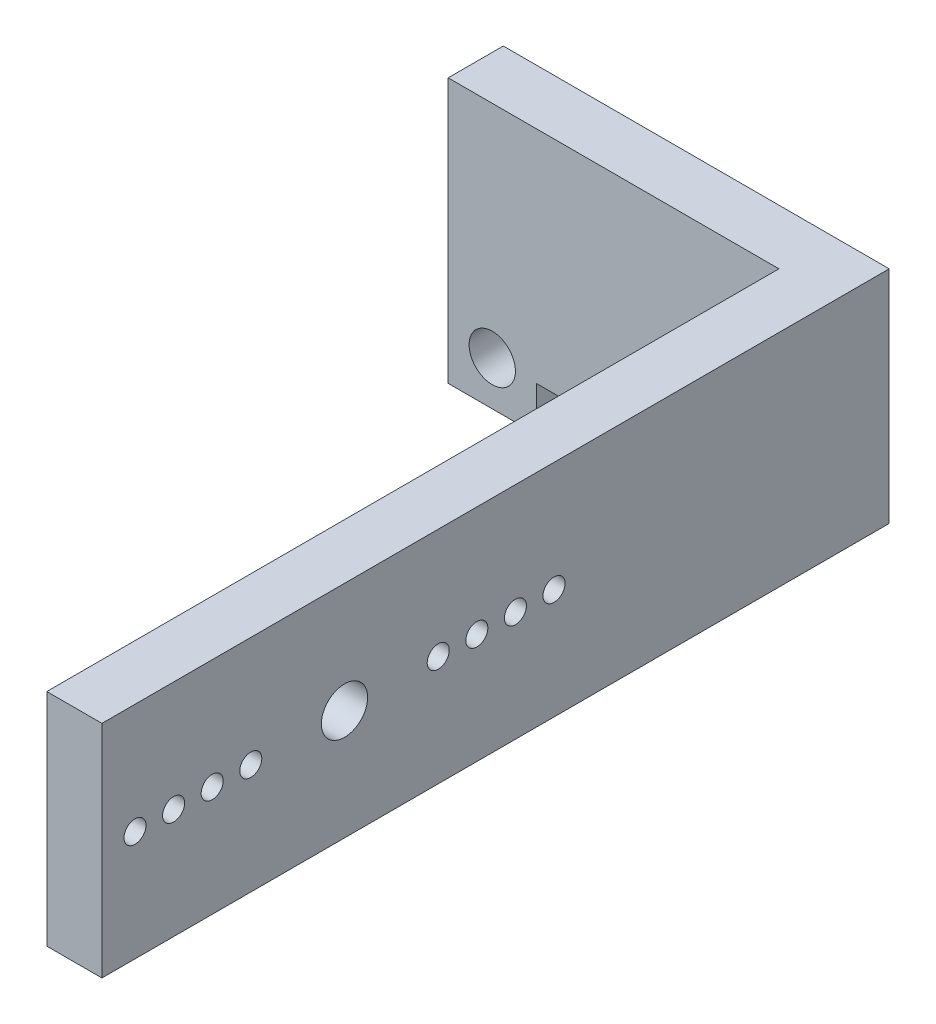
ISO-10303-21;
HEADER;
FILE_DESCRIPTION(('STEP AP214'),'2;1');
FILE_NAME('part.step','',(''),(''),'','','');
FILE_SCHEMA(('AUTOMOTIVE_DESIGN { 1 0 10303 214 1 1 1 1 }'));
ENDSEC;
DATA;
#1=APPLICATION_CONTEXT('core data for automotive mechanical design processes');
#2=APPLICATION_PROTOCOL_DEFINITION('international standard','automotive_design',2000,#1);
#3=PRODUCT_CONTEXT('',#1,'mechanical');
#4=PRODUCT('Part','Part','',(#3));
#5=PRODUCT_RELATED_PRODUCT_CATEGORY('part','',(#4));
#6=PRODUCT_DEFINITION_FORMATION('','',#4);
#7=PRODUCT_DEFINITION_CONTEXT('part definition',#1,'design');
#8=PRODUCT_DEFINITION('design','',#6,#7);
#9=PRODUCT_DEFINITION_SHAPE('','',#8);
#10=(LENGTH_UNIT() NAMED_UNIT(*) SI_UNIT(.MILLI.,.METRE.));
#11=(NAMED_UNIT(*) PLANE_ANGLE_UNIT() SI_UNIT($,.RADIAN.));
#12=(NAMED_UNIT(*) SI_UNIT($,.STERADIAN.) SOLID_ANGLE_UNIT());
#13=UNCERTAINTY_MEASURE_WITH_UNIT(LENGTH_MEASURE(1.E-05),#10,'distance_accuracy_value','');
#14=(GEOMETRIC_REPRESENTATION_CONTEXT(3) GLOBAL_UNCERTAINTY_ASSIGNED_CONTEXT((#13)) GLOBAL_UNIT_ASSIGNED_CONTEXT((#10,
#11,#12)) REPRESENTATION_CONTEXT('',''));
#15=CARTESIAN_POINT('',(0.,0.,0.));
#16=DIRECTION('',(0.,0.,1.));
#17=DIRECTION('',(1.,0.,0.));
#18=AXIS2_PLACEMENT_3D('',#15,#16,#17);
#19=CARTESIAN_POINT('',(4.,0.,5.));
#20=DIRECTION('',(1.,0.,0.));
#21=DIRECTION('',(0.,1.,0.));
#22=AXIS2_PLACEMENT_3D('',#19,#20,#21);
#23=PLANE('',#22);
#24=DIRECTION('',(0.,-1.,0.));
#25=VECTOR('',#24,1.);
#26=CARTESIAN_POINT('',(4.,0.,0.));
#27=LINE('',#26,#25);
#28=CARTESIAN_POINT('',(4.,0.,0.));
#29=VERTEX_POINT('',#28);
#30=CARTESIAN_POINT('',(4.,-4.,0.));
#31=VERTEX_POINT('',#30);
#32=EDGE_CURVE('E120',#29,#31,#27,.T.);
#33=ORIENTED_EDGE('',*,*,#32,.F.);
#34=DIRECTION('',(0.,0.,-1.));
#35=VECTOR('',#34,1.);
#36=CARTESIAN_POINT('',(4.,0.,5.));
#37=LINE('',#36,#35);
#38=CARTESIAN_POINT('',(4.,0.,5.));
#39=VERTEX_POINT('',#38);
#40=EDGE_CURVE('E11',#39,#29,#37,.T.);
#41=ORIENTED_EDGE('',*,*,#40,.F.);
#42=DIRECTION('',(0.,-1.,0.));
#43=VECTOR('',#42,1.);
#44=CARTESIAN_POINT('',(4.,0.,5.));
#45=LINE('',#44,#43);
#46=CARTESIAN_POINT('',(4.,-4.,5.));
#47=VERTEX_POINT('',#46);
#48=EDGE_CURVE('E134',#39,#47,#45,.T.);
#49=ORIENTED_EDGE('',*,*,#48,.T.);
#50=DIRECTION('',(0.,0.,-1.));
#51=VECTOR('',#50,1.);
#52=CARTESIAN_POINT('',(4.,-4.,5.));
#53=LINE('',#52,#51);
#54=EDGE_CURVE('E78',#47,#31,#53,.T.);
#55=ORIENTED_EDGE('',*,*,#54,.T.);
#56=EDGE_LOOP('',(#33,#41,#49,#55));
#57=FACE_BOUND('',#56,.T.);
#58=ADVANCED_FACE('F37',(#57),#23,.T.);
#59=CARTESIAN_POINT('',(0.,0.,5.));
#60=DIRECTION('',(0.,1.,0.));
#61=DIRECTION('',(0.,0.,1.));
#62=AXIS2_PLACEMENT_3D('',#59,#60,#61);
#63=PLANE('',#62);
#64=DIRECTION('',(1.,0.,0.));
#65=VECTOR('',#64,1.);
#66=CARTESIAN_POINT('',(0.,0.,0.));
#67=LINE('',#66,#65);
#68=CARTESIAN_POINT('',(31.,0.,0.));
#69=VERTEX_POINT('',#68);
#70=EDGE_CURVE('E123',#29,#69,#67,.T.);
#71=ORIENTED_EDGE('',*,*,#70,.T.);
#72=DIRECTION('',(0.,0.,1.));
#73=VECTOR('',#72,1.);
#74=CARTESIAN_POINT('',(31.,0.,0.));
#75=LINE('',#74,#73);
#76=CARTESIAN_POINT('',(31.,0.,71.4));
#77=VERTEX_POINT('',#76);
#78=EDGE_CURVE('E185',#69,#77,#75,.T.);
#79=ORIENTED_EDGE('',*,*,#78,.T.);
#80=DIRECTION('',(-1.,0.,0.));
#81=VECTOR('',#80,1.);
#82=CARTESIAN_POINT('',(31.,0.,71.4));
#83=LINE('',#82,#81);
#84=CARTESIAN_POINT('',(26.,0.,71.4));
#85=VERTEX_POINT('',#84);
#86=EDGE_CURVE('E124',#77,#85,#83,.T.);
#87=ORIENTED_EDGE('',*,*,#86,.T.);
#88=DIRECTION('',(0.,0.,1.));
#89=VECTOR('',#88,1.);
#90=CARTESIAN_POINT('',(26.,0.,0.));
#91=LINE('',#90,#89);
#92=CARTESIAN_POINT('',(26.,0.,5.));
#93=VERTEX_POINT('',#92);
#94=EDGE_CURVE('E202',#93,#85,#91,.T.);
#95=ORIENTED_EDGE('',*,*,#94,.F.);
#96=DIRECTION('',(1.,0.,0.));
#97=VECTOR('',#96,1.);
#98=CARTESIAN_POINT('',(0.,0.,5.));
#99=LINE('',#98,#97);
#100=EDGE_CURVE('E112',#39,#93,#99,.T.);
#101=ORIENTED_EDGE('',*,*,#100,.F.);
#102=ORIENTED_EDGE('',*,*,#40,.T.);
#103=EDGE_LOOP('',(#71,#79,#87,#95,#101,#102));
#104=FACE_BOUND('',#103,.T.);
#105=ADVANCED_FACE('F216',(#104),#63,.F.);
#106=CARTESIAN_POINT('',(0.,20.,5.));
#107=DIRECTION('',(0.,1.,0.));
#108=DIRECTION('',(0.,0.,1.));
#109=AXIS2_PLACEMENT_3D('',#106,#107,#108);
#110=PLANE('',#109);
#111=DIRECTION('',(1.,0.,0.));
#112=VECTOR('',#111,1.);
#113=CARTESIAN_POINT('',(0.,20.,0.));
#114=LINE('',#113,#112);
#115=CARTESIAN_POINT('',(-4.,20.,0.));
#116=VERTEX_POINT('',#115);
#117=CARTESIAN_POINT('',(31.,20.,0.));
#118=VERTEX_POINT('',#117);
#119=EDGE_CURVE('E100',#116,#118,#114,.T.);
#120=ORIENTED_EDGE('',*,*,#119,.F.);
#121=DIRECTION('',(0.,0.,-1.));
#122=VECTOR('',#121,1.);
#123=CARTESIAN_POINT('',(-4.,20.,5.));
#124=LINE('',#123,#122);
#125=CARTESIAN_POINT('',(-4.,20.,5.));
#126=VERTEX_POINT('',#125);
#127=EDGE_CURVE('E46',#126,#116,#124,.T.);
#128=ORIENTED_EDGE('',*,*,#127,.F.);
#129=DIRECTION('',(1.,0.,0.));
#130=VECTOR('',#129,1.);
#131=CARTESIAN_POINT('',(0.,20.,5.));
#132=LINE('',#131,#130);
#133=CARTESIAN_POINT('',(26.,20.,5.));
#134=VERTEX_POINT('',#133);
#135=EDGE_CURVE('E96',#126,#134,#132,.T.);
#136=ORIENTED_EDGE('',*,*,#135,.T.);
#137=DIRECTION('',(0.,0.,1.));
#138=VECTOR('',#137,1.);
#139=CARTESIAN_POINT('',(26.,20.,0.));
#140=LINE('',#139,#138);
#141=CARTESIAN_POINT('',(26.,20.,71.4));
#142=VERTEX_POINT('',#141);
#143=EDGE_CURVE('E182',#134,#142,#140,.T.);
#144=ORIENTED_EDGE('',*,*,#143,.T.);
#145=DIRECTION('',(-1.,0.,0.));
#146=VECTOR('',#145,1.);
#147=CARTESIAN_POINT('',(31.,20.,71.4));
#148=LINE('',#147,#146);
#149=CARTESIAN_POINT('',(31.,20.,71.4));
#150=VERTEX_POINT('',#149);
#151=EDGE_CURVE('E194',#150,#142,#148,.T.);
#152=ORIENTED_EDGE('',*,*,#151,.F.);
#153=DIRECTION('',(0.,0.,1.));
#154=VECTOR('',#153,1.);
#155=CARTESIAN_POINT('',(31.,20.,0.));
#156=LINE('',#155,#154);
#157=EDGE_CURVE('E191',#118,#150,#156,.T.);
#158=ORIENTED_EDGE('',*,*,#157,.F.);
#159=EDGE_LOOP('',(#120,#128,#136,#144,#152,#158));
#160=FACE_BOUND('',#159,.T.);
#161=ADVANCED_FACE('F93',(#160),#110,.T.);
#162=CARTESIAN_POINT('',(-4.,0.,5.));
#163=DIRECTION('',(1.,0.,0.));
#164=DIRECTION('',(0.,1.,0.));
#165=AXIS2_PLACEMENT_3D('',#162,#163,#164);
#166=PLANE('',#165);
#167=DIRECTION('',(0.,-1.,0.));
#168=VECTOR('',#167,1.);
#169=CARTESIAN_POINT('',(-4.,0.,0.));
#170=LINE('',#169,#168);
#171=CARTESIAN_POINT('',(-4.,-4.,0.));
#172=VERTEX_POINT('',#171);
#173=EDGE_CURVE('E71',#116,#172,#170,.T.);
#174=ORIENTED_EDGE('',*,*,#173,.T.);
#175=DIRECTION('',(0.,0.,-1.));
#176=VECTOR('',#175,1.);
#177=CARTESIAN_POINT('',(-4.,-4.,5.));
#178=LINE('',#177,#176);
#179=CARTESIAN_POINT('',(-4.,-4.,5.));
#180=VERTEX_POINT('',#179);
#181=EDGE_CURVE('E101',#180,#172,#178,.T.);
#182=ORIENTED_EDGE('',*,*,#181,.F.);
#183=DIRECTION('',(0.,-1.,0.));
#184=VECTOR('',#183,1.);
#185=CARTESIAN_POINT('',(-4.,0.,5.));
#186=LINE('',#185,#184);
#187=EDGE_CURVE('E103',#126,#180,#186,.T.);
#188=ORIENTED_EDGE('',*,*,#187,.F.);
#189=ORIENTED_EDGE('',*,*,#127,.T.);
#190=EDGE_LOOP('',(#174,#182,#188,#189));
#191=FACE_BOUND('',#190,.T.);
#192=ADVANCED_FACE('F104',(#191),#166,.F.);
#193=CARTESIAN_POINT('',(0.,-4.,5.));
#194=DIRECTION('',(0.,1.,0.));
#195=DIRECTION('',(0.,0.,1.));
#196=AXIS2_PLACEMENT_3D('',#193,#194,#195);
#197=PLANE('',#196);
#198=DIRECTION('',(1.,0.,0.));
#199=VECTOR('',#198,1.);
#200=CARTESIAN_POINT('',(0.,-4.,0.));
#201=LINE('',#200,#199);
#202=EDGE_CURVE('E129',#172,#31,#201,.T.);
#203=ORIENTED_EDGE('',*,*,#202,.T.);
#204=ORIENTED_EDGE('',*,*,#54,.F.);
#205=DIRECTION('',(1.,0.,0.));
#206=VECTOR('',#205,1.);
#207=CARTESIAN_POINT('',(0.,-4.,5.));
#208=LINE('',#207,#206);
#209=EDGE_CURVE('E55',#180,#47,#208,.T.);
#210=ORIENTED_EDGE('',*,*,#209,.F.);
#211=ORIENTED_EDGE('',*,*,#181,.T.);
#212=EDGE_LOOP('',(#203,#204,#210,#211));
#213=FACE_BOUND('',#212,.T.);
#214=ADVANCED_FACE('F263',(#213),#197,.F.);
#215=CARTESIAN_POINT('',(0.,0.,5.));
#216=DIRECTION('',(0.,0.,-1.));
#217=DIRECTION('',(-1.,0.,0.));
#218=AXIS2_PLACEMENT_3D('',#215,#216,#217);
#219=CYLINDRICAL_SURFACE('',#218,2.1);
#220=CARTESIAN_POINT('',(0.,0.,5.));
#221=DIRECTION('',(0.,0.,1.));
#222=DIRECTION('',(1.,0.,0.));
#223=AXIS2_PLACEMENT_3D('',#220,#221,#222);
#224=CIRCLE('',#223,2.1);
#225=CARTESIAN_POINT('',(2.1,0.,5.));
#226=VERTEX_POINT('',#225);
#227=EDGE_CURVE('E117',#226,#226,#224,.T.);
#228=ORIENTED_EDGE('',*,*,#227,.T.);
#229=EDGE_LOOP('',(#228));
#230=FACE_BOUND('',#229,.T.);
#231=CARTESIAN_POINT('',(0.,0.,0.));
#232=DIRECTION('',(0.,0.,1.));
#233=DIRECTION('',(1.,0.,0.));
#234=AXIS2_PLACEMENT_3D('',#231,#232,#233);
#235=CIRCLE('',#234,2.1);
#236=CARTESIAN_POINT('',(2.1,0.,0.));
#237=VERTEX_POINT('',#236);
#238=EDGE_CURVE('E131',#237,#237,#235,.T.);
#239=ORIENTED_EDGE('',*,*,#238,.F.);
#240=EDGE_LOOP('',(#239));
#241=FACE_BOUND('',#240,.T.);
#242=ADVANCED_FACE('F265',(#230,#241),#219,.F.);
#243=CARTESIAN_POINT('',(0.,0.,5.));
#244=DIRECTION('',(0.,0.,1.));
#245=DIRECTION('',(1.,0.,0.));
#246=AXIS2_PLACEMENT_3D('',#243,#244,#245);
#247=PLANE('',#246);
#248=ORIENTED_EDGE('',*,*,#48,.F.);
#249=ORIENTED_EDGE('',*,*,#100,.T.);
#250=DIRECTION('',(0.,-1.,0.));
#251=VECTOR('',#250,1.);
#252=CARTESIAN_POINT('',(26.,0.,5.));
#253=LINE('',#252,#251);
#254=EDGE_CURVE('E110',#134,#93,#253,.T.);
#255=ORIENTED_EDGE('',*,*,#254,.F.);
#256=ORIENTED_EDGE('',*,*,#135,.F.);
#257=ORIENTED_EDGE('',*,*,#187,.T.);
#258=ORIENTED_EDGE('',*,*,#209,.T.);
#259=EDGE_LOOP('',(#248,#249,#255,#256,#257,#258));
#260=FACE_BOUND('',#259,.T.);
#261=ORIENTED_EDGE('',*,*,#227,.F.);
#262=EDGE_LOOP('',(#261));
#263=FACE_BOUND('',#262,.T.);
#264=ADVANCED_FACE('F106',(#260,#263),#247,.T.);
#265=CARTESIAN_POINT('',(0.,0.,0.));
#266=DIRECTION('',(0.,0.,1.));
#267=DIRECTION('',(1.,0.,0.));
#268=AXIS2_PLACEMENT_3D('',#265,#266,#267);
#269=PLANE('',#268);
#270=ORIENTED_EDGE('',*,*,#32,.T.);
#271=ORIENTED_EDGE('',*,*,#202,.F.);
#272=ORIENTED_EDGE('',*,*,#173,.F.);
#273=ORIENTED_EDGE('',*,*,#119,.T.);
#274=DIRECTION('',(0.,1.,0.));
#275=VECTOR('',#274,1.);
#276=CARTESIAN_POINT('',(31.,0.,0.));
#277=LINE('',#276,#275);
#278=EDGE_CURVE('E188',#69,#118,#277,.T.);
#279=ORIENTED_EDGE('',*,*,#278,.F.);
#280=ORIENTED_EDGE('',*,*,#70,.F.);
#281=EDGE_LOOP('',(#270,#271,#272,#273,#279,#280));
#282=FACE_BOUND('',#281,.T.);
#283=ORIENTED_EDGE('',*,*,#238,.T.);
#284=EDGE_LOOP('',(#283));
#285=FACE_BOUND('',#284,.T.);
#286=ADVANCED_FACE('F236',(#282,#285),#269,.F.);
#287=CARTESIAN_POINT('',(26.,0.,0.));
#288=DIRECTION('',(1.,0.,0.));
#289=DIRECTION('',(0.,0.,-1.));
#290=AXIS2_PLACEMENT_3D('',#287,#288,#289);
#291=PLANE('',#290);
#292=CARTESIAN_POINT('',(26.,10.,33.9));
#293=DIRECTION('',(1.,0.,0.));
#294=DIRECTION('',(0.,0.,-1.));
#295=AXIS2_PLACEMENT_3D('',#292,#293,#294);
#296=CIRCLE('',#295,2.1);
#297=CARTESIAN_POINT('',(26.,10.,31.8));
#298=VERTEX_POINT('',#297);
#299=EDGE_CURVE('E529',#298,#298,#296,.T.);
#300=ORIENTED_EDGE('',*,*,#299,.T.);
#301=EDGE_LOOP('',(#300));
#302=FACE_BOUND('',#301,.T.);
#303=CARTESIAN_POINT('',(26.,10.,40.9));
#304=DIRECTION('',(1.,0.,0.));
#305=DIRECTION('',(0.,0.,-1.));
#306=AXIS2_PLACEMENT_3D('',#303,#304,#305);
#307=CIRCLE('',#306,2.1);
#308=CARTESIAN_POINT('',(26.,10.,38.8));
#309=VERTEX_POINT('',#308);
#310=EDGE_CURVE('E531',#309,#309,#307,.T.);
#311=ORIENTED_EDGE('',*,*,#310,.T.);
#312=EDGE_LOOP('',(#311));
#313=FACE_BOUND('',#312,.T.);
#314=CARTESIAN_POINT('',(26.,10.,64.9));
#315=DIRECTION('',(1.,0.,0.));
#316=DIRECTION('',(0.,0.,-1.));
#317=AXIS2_PLACEMENT_3D('',#314,#315,#316);
#318=CIRCLE('',#317,2.09999999999999);
#319=CARTESIAN_POINT('',(26.,10.,62.8));
#320=VERTEX_POINT('',#319);
#321=EDGE_CURVE('E585',#320,#320,#318,.T.);
#322=ORIENTED_EDGE('',*,*,#321,.T.);
#323=EDGE_LOOP('',(#322));
#324=FACE_BOUND('',#323,.T.);
#325=CARTESIAN_POINT('',(26.,10.,57.9));
#326=DIRECTION('',(1.,0.,0.));
#327=DIRECTION('',(0.,0.,-1.));
#328=AXIS2_PLACEMENT_3D('',#325,#326,#327);
#329=CIRCLE('',#328,2.1);
#330=CARTESIAN_POINT('',(26.,10.,55.8));
#331=VERTEX_POINT('',#330);
#332=EDGE_CURVE('E537',#331,#331,#329,.T.);
#333=ORIENTED_EDGE('',*,*,#332,.T.);
#334=EDGE_LOOP('',(#333));
#335=FACE_BOUND('',#334,.T.);
#336=CARTESIAN_POINT('',(26.,10.,30.4));
#337=DIRECTION('',(1.,0.,0.));
#338=DIRECTION('',(0.,0.,-1.));
#339=AXIS2_PLACEMENT_3D('',#336,#337,#338);
#340=CIRCLE('',#339,0.999999999999998);
#341=CARTESIAN_POINT('',(26.,10.,29.4));
#342=VERTEX_POINT('',#341);
#343=EDGE_CURVE('E199',#342,#342,#340,.F.);
#344=ORIENTED_EDGE('',*,*,#343,.F.);
#345=EDGE_LOOP('',(#344));
#346=FACE_BOUND('',#345,.T.);
#347=CARTESIAN_POINT('',(26.,10.,61.4));
#348=DIRECTION('',(1.,0.,0.));
#349=DIRECTION('',(0.,0.,-1.));
#350=AXIS2_PLACEMENT_3D('',#347,#348,#349);
#351=CIRCLE('',#350,0.999999999999998);
#352=CARTESIAN_POINT('',(26.,10.,60.4));
#353=VERTEX_POINT('',#352);
#354=EDGE_CURVE('E152',#353,#353,#351,.F.);
#355=ORIENTED_EDGE('',*,*,#354,.F.);
#356=EDGE_LOOP('',(#355));
#357=FACE_BOUND('',#356,.T.);
#358=CARTESIAN_POINT('',(26.,10.,68.4));
#359=DIRECTION('',(1.,0.,0.));
#360=DIRECTION('',(0.,0.,-1.));
#361=AXIS2_PLACEMENT_3D('',#358,#359,#360);
#362=CIRCLE('',#361,0.999999999999998);
#363=CARTESIAN_POINT('',(26.,10.,67.4));
#364=VERTEX_POINT('',#363);
#365=EDGE_CURVE('E545',#364,#364,#362,.F.);
#366=ORIENTED_EDGE('',*,*,#365,.F.);
#367=EDGE_LOOP('',(#366));
#368=FACE_BOUND('',#367,.T.);
#369=CARTESIAN_POINT('',(26.,10.,37.4));
#370=DIRECTION('',(1.,0.,0.));
#371=DIRECTION('',(0.,0.,-1.));
#372=AXIS2_PLACEMENT_3D('',#369,#370,#371);
#373=CIRCLE('',#372,0.999999999999998);
#374=CARTESIAN_POINT('',(26.,10.,36.4));
#375=VERTEX_POINT('',#374);
#376=EDGE_CURVE('E166',#375,#375,#373,.F.);
#377=ORIENTED_EDGE('',*,*,#376,.F.);
#378=EDGE_LOOP('',(#377));
#379=FACE_BOUND('',#378,.T.);
#380=CARTESIAN_POINT('',(26.,10.,49.4));
#381=DIRECTION('',(1.,0.,0.));
#382=DIRECTION('',(0.,0.,-1.));
#383=AXIS2_PLACEMENT_3D('',#380,#381,#382);
#384=CIRCLE('',#383,2.1);
#385=CARTESIAN_POINT('',(26.,10.,47.3));
#386=VERTEX_POINT('',#385);
#387=EDGE_CURVE('E195',#386,#386,#384,.T.);
#388=ORIENTED_EDGE('',*,*,#387,.T.);
#389=EDGE_LOOP('',(#388));
#390=FACE_BOUND('',#389,.T.);
#391=ORIENTED_EDGE('',*,*,#143,.F.);
#392=ORIENTED_EDGE('',*,*,#254,.T.);
#393=ORIENTED_EDGE('',*,*,#94,.T.);
#394=DIRECTION('',(0.,1.,0.));
#395=VECTOR('',#394,1.);
#396=CARTESIAN_POINT('',(26.,0.,71.4));
#397=LINE('',#396,#395);
#398=EDGE_CURVE('E198',#85,#142,#397,.T.);
#399=ORIENTED_EDGE('',*,*,#398,.T.);
#400=EDGE_LOOP('',(#391,#392,#393,#399));
#401=FACE_BOUND('',#400,.T.);
#402=ADVANCED_FACE('F214',(#302,#313,#324,#335,#346,#357,#368,#379,#390,#401),#291,.F.);
#403=CARTESIAN_POINT('',(31.,0.,71.4));
#404=DIRECTION('',(0.,0.,1.));
#405=DIRECTION('',(1.,0.,0.));
#406=AXIS2_PLACEMENT_3D('',#403,#404,#405);
#407=PLANE('',#406);
#408=ORIENTED_EDGE('',*,*,#398,.F.);
#409=ORIENTED_EDGE('',*,*,#86,.F.);
#410=DIRECTION('',(0.,1.,0.));
#411=VECTOR('',#410,1.);
#412=CARTESIAN_POINT('',(31.,0.,71.4));
#413=LINE('',#412,#411);
#414=EDGE_CURVE('E181',#77,#150,#413,.T.);
#415=ORIENTED_EDGE('',*,*,#414,.T.);
#416=ORIENTED_EDGE('',*,*,#151,.T.);
#417=EDGE_LOOP('',(#408,#409,#415,#416));
#418=FACE_BOUND('',#417,.T.);
#419=ADVANCED_FACE('F225',(#418),#407,.T.);
#420=CARTESIAN_POINT('',(31.,10.,49.4));
#421=DIRECTION('',(-1.,0.,0.));
#422=DIRECTION('',(0.,0.,1.));
#423=AXIS2_PLACEMENT_3D('',#420,#421,#422);
#424=CYLINDRICAL_SURFACE('',#423,2.1);
#425=CARTESIAN_POINT('',(31.,10.,49.4));
#426=DIRECTION('',(1.,0.,0.));
#427=DIRECTION('',(0.,0.,-1.));
#428=AXIS2_PLACEMENT_3D('',#425,#426,#427);
#429=CIRCLE('',#428,2.1);
#430=CARTESIAN_POINT('',(31.,10.,47.3));
#431=VERTEX_POINT('',#430);
#432=EDGE_CURVE('E178',#431,#431,#429,.T.);
#433=ORIENTED_EDGE('',*,*,#432,.T.);
#434=EDGE_LOOP('',(#433));
#435=FACE_BOUND('',#434,.T.);
#436=ORIENTED_EDGE('',*,*,#387,.F.);
#437=EDGE_LOOP('',(#436));
#438=FACE_BOUND('',#437,.T.);
#439=ADVANCED_FACE('F242',(#435,#438),#424,.F.);
#440=CARTESIAN_POINT('',(31.,0.,0.));
#441=DIRECTION('',(1.,0.,0.));
#442=DIRECTION('',(0.,0.,-1.));
#443=AXIS2_PLACEMENT_3D('',#440,#441,#442);
#444=PLANE('',#443);
#445=CARTESIAN_POINT('',(31.,10.,30.4));
#446=DIRECTION('',(1.,0.,0.));
#447=DIRECTION('',(0.,0.,-1.));
#448=AXIS2_PLACEMENT_3D('',#445,#446,#447);
#449=CIRCLE('',#448,0.999999999999998);
#450=CARTESIAN_POINT('',(31.,10.,29.4));
#451=VERTEX_POINT('',#450);
#452=EDGE_CURVE('E164',#451,#451,#449,.T.);
#453=ORIENTED_EDGE('',*,*,#452,.F.);
#454=EDGE_LOOP('',(#453));
#455=FACE_BOUND('',#454,.T.);
#456=CARTESIAN_POINT('',(31.,10.,57.9));
#457=DIRECTION('',(1.,0.,0.));
#458=DIRECTION('',(0.,0.,-1.));
#459=AXIS2_PLACEMENT_3D('',#456,#457,#458);
#460=CIRCLE('',#459,0.999999999999998);
#461=CARTESIAN_POINT('',(31.,10.,56.9));
#462=VERTEX_POINT('',#461);
#463=EDGE_CURVE('E148',#462,#462,#460,.T.);
#464=ORIENTED_EDGE('',*,*,#463,.F.);
#465=EDGE_LOOP('',(#464));
#466=FACE_BOUND('',#465,.T.);
#467=CARTESIAN_POINT('',(31.,10.,61.4));
#468=DIRECTION('',(1.,0.,0.));
#469=DIRECTION('',(0.,0.,-1.));
#470=AXIS2_PLACEMENT_3D('',#467,#468,#469);
#471=CIRCLE('',#470,0.999999999999998);
#472=CARTESIAN_POINT('',(31.,10.,60.4));
#473=VERTEX_POINT('',#472);
#474=EDGE_CURVE('E157',#473,#473,#471,.T.);
#475=ORIENTED_EDGE('',*,*,#474,.F.);
#476=EDGE_LOOP('',(#475));
#477=FACE_BOUND('',#476,.T.);
#478=CARTESIAN_POINT('',(31.,10.,68.4));
#479=DIRECTION('',(1.,0.,0.));
#480=DIRECTION('',(0.,0.,-1.));
#481=AXIS2_PLACEMENT_3D('',#478,#479,#480);
#482=CIRCLE('',#481,0.999999999999998);
#483=CARTESIAN_POINT('',(31.,10.,67.4));
#484=VERTEX_POINT('',#483);
#485=EDGE_CURVE('E177',#484,#484,#482,.T.);
#486=ORIENTED_EDGE('',*,*,#485,.F.);
#487=EDGE_LOOP('',(#486));
#488=FACE_BOUND('',#487,.T.);
#489=CARTESIAN_POINT('',(31.,10.,64.9));
#490=DIRECTION('',(1.,0.,0.));
#491=DIRECTION('',(0.,0.,-1.));
#492=AXIS2_PLACEMENT_3D('',#489,#490,#491);
#493=CIRCLE('',#492,0.999999999999998);
#494=CARTESIAN_POINT('',(31.,10.,63.9));
#495=VERTEX_POINT('',#494);
#496=EDGE_CURVE('E174',#495,#495,#493,.T.);
#497=ORIENTED_EDGE('',*,*,#496,.F.);
#498=EDGE_LOOP('',(#497));
#499=FACE_BOUND('',#498,.T.);
#500=CARTESIAN_POINT('',(31.,10.,40.9));
#501=DIRECTION('',(1.,0.,0.));
#502=DIRECTION('',(0.,0.,-1.));
#503=AXIS2_PLACEMENT_3D('',#500,#501,#502);
#504=CIRCLE('',#503,0.999999999999998);
#505=CARTESIAN_POINT('',(31.,10.,39.9));
#506=VERTEX_POINT('',#505);
#507=EDGE_CURVE('E169',#506,#506,#504,.T.);
#508=ORIENTED_EDGE('',*,*,#507,.F.);
#509=EDGE_LOOP('',(#508));
#510=FACE_BOUND('',#509,.T.);
#511=CARTESIAN_POINT('',(31.,10.,37.4));
#512=DIRECTION('',(1.,0.,0.));
#513=DIRECTION('',(0.,0.,-1.));
#514=AXIS2_PLACEMENT_3D('',#511,#512,#513);
#515=CIRCLE('',#514,0.999999999999998);
#516=CARTESIAN_POINT('',(31.,10.,36.4));
#517=VERTEX_POINT('',#516);
#518=EDGE_CURVE('E165',#517,#517,#515,.T.);
#519=ORIENTED_EDGE('',*,*,#518,.F.);
#520=EDGE_LOOP('',(#519));
#521=FACE_BOUND('',#520,.T.);
#522=CARTESIAN_POINT('',(31.,10.,33.9));
#523=DIRECTION('',(1.,0.,0.));
#524=DIRECTION('',(0.,0.,-1.));
#525=AXIS2_PLACEMENT_3D('',#522,#523,#524);
#526=CIRCLE('',#525,0.999999999999998);
#527=CARTESIAN_POINT('',(31.,10.,32.9));
#528=VERTEX_POINT('',#527);
#529=EDGE_CURVE('E161',#528,#528,#526,.T.);
#530=ORIENTED_EDGE('',*,*,#529,.F.);
#531=EDGE_LOOP('',(#530));
#532=FACE_BOUND('',#531,.T.);
#533=ORIENTED_EDGE('',*,*,#432,.F.);
#534=EDGE_LOOP('',(#533));
#535=FACE_BOUND('',#534,.T.);
#536=ORIENTED_EDGE('',*,*,#414,.F.);
#537=ORIENTED_EDGE('',*,*,#78,.F.);
#538=ORIENTED_EDGE('',*,*,#278,.T.);
#539=ORIENTED_EDGE('',*,*,#157,.T.);
#540=EDGE_LOOP('',(#536,#537,#538,#539));
#541=FACE_BOUND('',#540,.T.);
#542=ADVANCED_FACE('F239',(#455,#466,#477,#488,#499,#510,#521,#532,#535,#541),#444,.T.);
#543=CARTESIAN_POINT('',(-4.001,10.,33.9));
#544=DIRECTION('',(1.,0.,0.));
#545=DIRECTION('',(0.,0.,-1.));
#546=AXIS2_PLACEMENT_3D('',#543,#544,#545);
#547=CYLINDRICAL_SURFACE('',#546,0.999999999999998);
#548=CARTESIAN_POINT('',(29.,10.,33.9));
#549=DIRECTION('',(1.,0.,0.));
#550=DIRECTION('',(0.,0.,-1.));
#551=AXIS2_PLACEMENT_3D('',#548,#549,#550);
#552=CIRCLE('',#551,0.999999999999998);
#553=CARTESIAN_POINT('',(29.,10.,32.9));
#554=VERTEX_POINT('',#553);
#555=EDGE_CURVE('E40',#554,#554,#552,.F.);
#556=ORIENTED_EDGE('',*,*,#555,.T.);
#557=EDGE_LOOP('',(#556));
#558=FACE_BOUND('',#557,.T.);
#559=ORIENTED_EDGE('',*,*,#529,.T.);
#560=EDGE_LOOP('',(#559));
#561=FACE_BOUND('',#560,.T.);
#562=ADVANCED_FACE('F241',(#558,#561),#547,.F.);
#563=CARTESIAN_POINT('',(-4.001,10.,37.4));
#564=DIRECTION('',(1.,0.,0.));
#565=DIRECTION('',(0.,0.,-1.));
#566=AXIS2_PLACEMENT_3D('',#563,#564,#565);
#567=CYLINDRICAL_SURFACE('',#566,0.999999999999998);
#568=ORIENTED_EDGE('',*,*,#518,.T.);
#569=EDGE_LOOP('',(#568));
#570=FACE_BOUND('',#569,.T.);
#571=ORIENTED_EDGE('',*,*,#376,.T.);
#572=EDGE_LOOP('',(#571));
#573=FACE_BOUND('',#572,.T.);
#574=ADVANCED_FACE('F249',(#570,#573),#567,.F.);
#575=CARTESIAN_POINT('',(-4.001,10.,40.9));
#576=DIRECTION('',(1.,0.,0.));
#577=DIRECTION('',(0.,0.,-1.));
#578=AXIS2_PLACEMENT_3D('',#575,#576,#577);
#579=CYLINDRICAL_SURFACE('',#578,0.999999999999998);
#580=CARTESIAN_POINT('',(29.,10.,40.9));
#581=DIRECTION('',(1.,0.,0.));
#582=DIRECTION('',(0.,0.,-1.));
#583=AXIS2_PLACEMENT_3D('',#580,#581,#582);
#584=CIRCLE('',#583,0.999999999999998);
#585=CARTESIAN_POINT('',(29.,10.,39.9));
#586=VERTEX_POINT('',#585);
#587=EDGE_CURVE('E143',#586,#586,#584,.F.);
#588=ORIENTED_EDGE('',*,*,#587,.T.);
#589=EDGE_LOOP('',(#588));
#590=FACE_BOUND('',#589,.T.);
#591=ORIENTED_EDGE('',*,*,#507,.T.);
#592=EDGE_LOOP('',(#591));
#593=FACE_BOUND('',#592,.T.);
#594=ADVANCED_FACE('F383',(#590,#593),#579,.F.);
#595=CARTESIAN_POINT('',(-4.001,10.,64.9));
#596=DIRECTION('',(1.,0.,0.));
#597=DIRECTION('',(0.,0.,-1.));
#598=AXIS2_PLACEMENT_3D('',#595,#596,#597);
#599=CYLINDRICAL_SURFACE('',#598,0.999999999999998);
#600=CARTESIAN_POINT('',(29.,10.,64.9));
#601=DIRECTION('',(1.,0.,0.));
#602=DIRECTION('',(0.,0.,-1.));
#603=AXIS2_PLACEMENT_3D('',#600,#601,#602);
#604=CIRCLE('',#603,0.999999999999998);
#605=CARTESIAN_POINT('',(29.,10.,63.9));
#606=VERTEX_POINT('',#605);
#607=EDGE_CURVE('E140',#606,#606,#604,.F.);
#608=ORIENTED_EDGE('',*,*,#607,.T.);
#609=EDGE_LOOP('',(#608));
#610=FACE_BOUND('',#609,.T.);
#611=ORIENTED_EDGE('',*,*,#496,.T.);
#612=EDGE_LOOP('',(#611));
#613=FACE_BOUND('',#612,.T.);
#614=ADVANCED_FACE('F392',(#610,#613),#599,.F.);
#615=CARTESIAN_POINT('',(-4.001,10.,68.4));
#616=DIRECTION('',(1.,0.,0.));
#617=DIRECTION('',(0.,0.,-1.));
#618=AXIS2_PLACEMENT_3D('',#615,#616,#617);
#619=CYLINDRICAL_SURFACE('',#618,0.999999999999998);
#620=ORIENTED_EDGE('',*,*,#485,.T.);
#621=EDGE_LOOP('',(#620));
#622=FACE_BOUND('',#621,.T.);
#623=ORIENTED_EDGE('',*,*,#365,.T.);
#624=EDGE_LOOP('',(#623));
#625=FACE_BOUND('',#624,.T.);
#626=ADVANCED_FACE('F400',(#622,#625),#619,.F.);
#627=CARTESIAN_POINT('',(-4.001,10.,61.4));
#628=DIRECTION('',(1.,0.,0.));
#629=DIRECTION('',(0.,0.,-1.));
#630=AXIS2_PLACEMENT_3D('',#627,#628,#629);
#631=CYLINDRICAL_SURFACE('',#630,0.999999999999998);
#632=ORIENTED_EDGE('',*,*,#474,.T.);
#633=EDGE_LOOP('',(#632));
#634=FACE_BOUND('',#633,.T.);
#635=ORIENTED_EDGE('',*,*,#354,.T.);
#636=EDGE_LOOP('',(#635));
#637=FACE_BOUND('',#636,.T.);
#638=ADVANCED_FACE('F408',(#634,#637),#631,.F.);
#639=CARTESIAN_POINT('',(-4.001,10.,57.9));
#640=DIRECTION('',(1.,0.,0.));
#641=DIRECTION('',(0.,0.,-1.));
#642=AXIS2_PLACEMENT_3D('',#639,#640,#641);
#643=CYLINDRICAL_SURFACE('',#642,0.999999999999998);
#644=CARTESIAN_POINT('',(29.,10.,57.9));
#645=DIRECTION('',(1.,0.,0.));
#646=DIRECTION('',(0.,0.,-1.));
#647=AXIS2_PLACEMENT_3D('',#644,#645,#646);
#648=CIRCLE('',#647,0.999999999999998);
#649=CARTESIAN_POINT('',(29.,10.,56.9));
#650=VERTEX_POINT('',#649);
#651=EDGE_CURVE('E137',#650,#650,#648,.F.);
#652=ORIENTED_EDGE('',*,*,#651,.T.);
#653=EDGE_LOOP('',(#652));
#654=FACE_BOUND('',#653,.T.);
#655=ORIENTED_EDGE('',*,*,#463,.T.);
#656=EDGE_LOOP('',(#655));
#657=FACE_BOUND('',#656,.T.);
#658=ADVANCED_FACE('F417',(#654,#657),#643,.F.);
#659=CARTESIAN_POINT('',(-4.001,10.,30.4));
#660=DIRECTION('',(1.,0.,0.));
#661=DIRECTION('',(0.,0.,-1.));
#662=AXIS2_PLACEMENT_3D('',#659,#660,#661);
#663=CYLINDRICAL_SURFACE('',#662,0.999999999999998);
#664=ORIENTED_EDGE('',*,*,#452,.T.);
#665=EDGE_LOOP('',(#664));
#666=FACE_BOUND('',#665,.T.);
#667=ORIENTED_EDGE('',*,*,#343,.T.);
#668=EDGE_LOOP('',(#667));
#669=FACE_BOUND('',#668,.T.);
#670=ADVANCED_FACE('F425',(#666,#669),#663,.F.);
#671=CARTESIAN_POINT('',(29.,10.,57.9));
#672=DIRECTION('',(1.,0.,0.));
#673=DIRECTION('',(0.,0.,-1.));
#674=AXIS2_PLACEMENT_3D('',#671,#672,#673);
#675=PLANE('',#674);
#676=CARTESIAN_POINT('',(29.,10.,57.9));
#677=DIRECTION('',(1.,0.,0.));
#678=DIRECTION('',(0.,0.,-1.));
#679=AXIS2_PLACEMENT_3D('',#676,#677,#678);
#680=CIRCLE('',#679,2.1);
#681=CARTESIAN_POINT('',(29.,10.,55.8));
#682=VERTEX_POINT('',#681);
#683=EDGE_CURVE('E141',#682,#682,#680,.T.);
#684=ORIENTED_EDGE('',*,*,#683,.F.);
#685=EDGE_LOOP('',(#684));
#686=FACE_BOUND('',#685,.T.);
#687=ORIENTED_EDGE('',*,*,#651,.F.);
#688=EDGE_LOOP('',(#687));
#689=FACE_BOUND('',#688,.T.);
#690=ADVANCED_FACE('F434',(#686,#689),#675,.F.);
#691=CARTESIAN_POINT('',(29.,10.,57.9));
#692=DIRECTION('',(-1.,0.,0.));
#693=DIRECTION('',(0.,0.,1.));
#694=AXIS2_PLACEMENT_3D('',#691,#692,#693);
#695=CYLINDRICAL_SURFACE('',#694,2.1);
#696=ORIENTED_EDGE('',*,*,#683,.T.);
#697=EDGE_LOOP('',(#696));
#698=FACE_BOUND('',#697,.T.);
#699=ORIENTED_EDGE('',*,*,#332,.F.);
#700=EDGE_LOOP('',(#699));
#701=FACE_BOUND('',#700,.T.);
#702=ADVANCED_FACE('F442',(#698,#701),#695,.F.);
#703=CARTESIAN_POINT('',(29.,10.,64.9));
#704=DIRECTION('',(1.,0.,0.));
#705=DIRECTION('',(0.,0.,-1.));
#706=AXIS2_PLACEMENT_3D('',#703,#704,#705);
#707=PLANE('',#706);
#708=CARTESIAN_POINT('',(29.,10.,64.9));
#709=DIRECTION('',(1.,0.,0.));
#710=DIRECTION('',(0.,0.,-1.));
#711=AXIS2_PLACEMENT_3D('',#708,#709,#710);
#712=CIRCLE('',#711,2.09999999999999);
#713=CARTESIAN_POINT('',(29.,10.,62.8));
#714=VERTEX_POINT('',#713);
#715=EDGE_CURVE('E540',#714,#714,#712,.T.);
#716=ORIENTED_EDGE('',*,*,#715,.F.);
#717=EDGE_LOOP('',(#716));
#718=FACE_BOUND('',#717,.T.);
#719=ORIENTED_EDGE('',*,*,#607,.F.);
#720=EDGE_LOOP('',(#719));
#721=FACE_BOUND('',#720,.T.);
#722=ADVANCED_FACE('F451',(#718,#721),#707,.F.);
#723=CARTESIAN_POINT('',(29.,10.,64.9));
#724=DIRECTION('',(-1.,0.,0.));
#725=DIRECTION('',(0.,0.,1.));
#726=AXIS2_PLACEMENT_3D('',#723,#724,#725);
#727=CYLINDRICAL_SURFACE('',#726,2.09999999999999);
#728=ORIENTED_EDGE('',*,*,#715,.T.);
#729=EDGE_LOOP('',(#728));
#730=FACE_BOUND('',#729,.T.);
#731=ORIENTED_EDGE('',*,*,#321,.F.);
#732=EDGE_LOOP('',(#731));
#733=FACE_BOUND('',#732,.T.);
#734=ADVANCED_FACE('F460',(#730,#733),#727,.F.);
#735=CARTESIAN_POINT('',(29.,10.,40.9));
#736=DIRECTION('',(1.,0.,0.));
#737=DIRECTION('',(0.,0.,-1.));
#738=AXIS2_PLACEMENT_3D('',#735,#736,#737);
#739=PLANE('',#738);
#740=CARTESIAN_POINT('',(29.,10.,40.9));
#741=DIRECTION('',(1.,0.,0.));
#742=DIRECTION('',(0.,0.,-1.));
#743=AXIS2_PLACEMENT_3D('',#740,#741,#742);
#744=CIRCLE('',#743,2.1);
#745=CARTESIAN_POINT('',(29.,10.,38.8));
#746=VERTEX_POINT('',#745);
#747=EDGE_CURVE('E589',#746,#746,#744,.T.);
#748=ORIENTED_EDGE('',*,*,#747,.F.);
#749=EDGE_LOOP('',(#748));
#750=FACE_BOUND('',#749,.T.);
#751=ORIENTED_EDGE('',*,*,#587,.F.);
#752=EDGE_LOOP('',(#751));
#753=FACE_BOUND('',#752,.T.);
#754=ADVANCED_FACE('F469',(#750,#753),#739,.F.);
#755=CARTESIAN_POINT('',(29.,10.,40.9));
#756=DIRECTION('',(-1.,0.,0.));
#757=DIRECTION('',(0.,0.,1.));
#758=AXIS2_PLACEMENT_3D('',#755,#756,#757);
#759=CYLINDRICAL_SURFACE('',#758,2.1);
#760=ORIENTED_EDGE('',*,*,#747,.T.);
#761=EDGE_LOOP('',(#760));
#762=FACE_BOUND('',#761,.T.);
#763=ORIENTED_EDGE('',*,*,#310,.F.);
#764=EDGE_LOOP('',(#763));
#765=FACE_BOUND('',#764,.T.);
#766=ADVANCED_FACE('F478',(#762,#765),#759,.F.);
#767=CARTESIAN_POINT('',(29.,10.,33.9));
#768=DIRECTION('',(1.,0.,0.));
#769=DIRECTION('',(0.,0.,-1.));
#770=AXIS2_PLACEMENT_3D('',#767,#768,#769);
#771=PLANE('',#770);
#772=CARTESIAN_POINT('',(29.,10.,33.9));
#773=DIRECTION('',(1.,0.,0.));
#774=DIRECTION('',(0.,0.,-1.));
#775=AXIS2_PLACEMENT_3D('',#772,#773,#774);
#776=CIRCLE('',#775,2.1);
#777=CARTESIAN_POINT('',(29.,10.,31.8));
#778=VERTEX_POINT('',#777);
#779=EDGE_CURVE('E526',#778,#778,#776,.T.);
#780=ORIENTED_EDGE('',*,*,#779,.F.);
#781=EDGE_LOOP('',(#780));
#782=FACE_BOUND('',#781,.T.);
#783=ORIENTED_EDGE('',*,*,#555,.F.);
#784=EDGE_LOOP('',(#783));
#785=FACE_BOUND('',#784,.T.);
#786=ADVANCED_FACE('F487',(#782,#785),#771,.F.);
#787=CARTESIAN_POINT('',(29.,10.,33.9));
#788=DIRECTION('',(-1.,0.,0.));
#789=DIRECTION('',(0.,0.,1.));
#790=AXIS2_PLACEMENT_3D('',#787,#788,#789);
#791=CYLINDRICAL_SURFACE('',#790,2.1);
#792=ORIENTED_EDGE('',*,*,#779,.T.);
#793=EDGE_LOOP('',(#792));
#794=FACE_BOUND('',#793,.T.);
#795=ORIENTED_EDGE('',*,*,#299,.F.);
#796=EDGE_LOOP('',(#795));
#797=FACE_BOUND('',#796,.T.);
#798=ADVANCED_FACE('F496',(#794,#797),#791,.F.);
#799=CLOSED_SHELL('',(#58,#105,#161,#192,#214,#242,#264,#286,#402,#419,#439,#542,#562,#574,#594,
#614,#626,#638,#658,#670,#690,#702,#722,#734,#754,#766,#786,#798));
#800=MANIFOLD_SOLID_BREP('B2',#799);
#801=ADVANCED_BREP_SHAPE_REPRESENTATION('',(#18,#800),#14);
#802=SHAPE_DEFINITION_REPRESENTATION(#9,#801);
ENDSEC;
END-ISO-10303-21;
